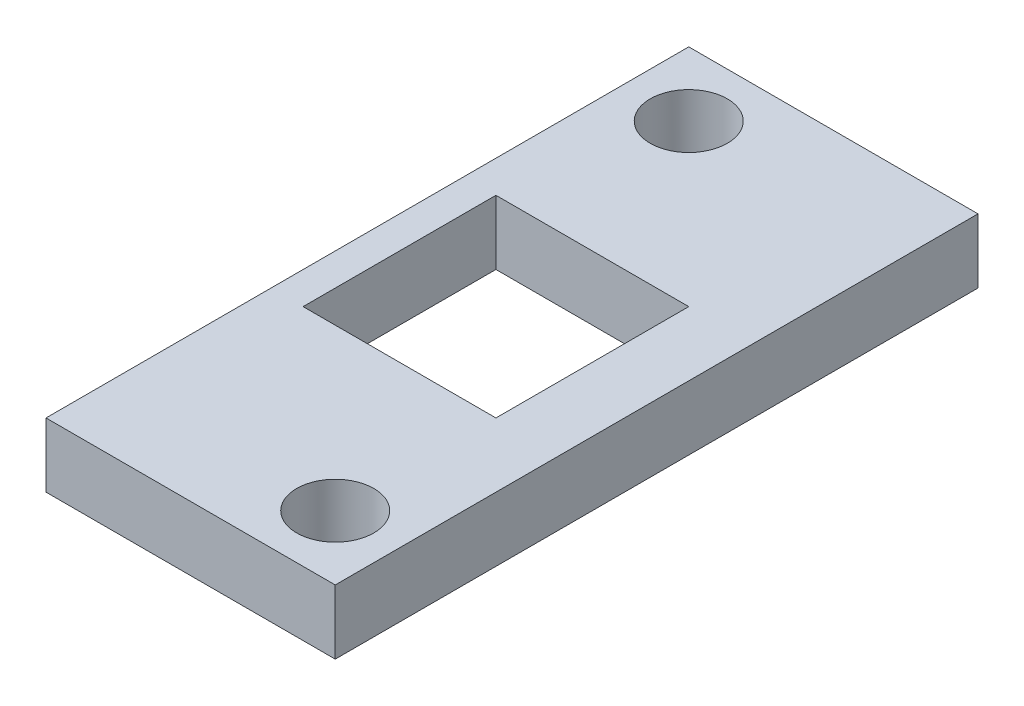
ISO-10303-21;
HEADER;
FILE_DESCRIPTION(('STEP AP214'),'2;1');
FILE_NAME('part.step','',(''),(''),'','','');
FILE_SCHEMA(('AUTOMOTIVE_DESIGN { 1 0 10303 214 1 1 1 1 }'));
ENDSEC;
DATA;
#1=APPLICATION_CONTEXT('core data for automotive mechanical design processes');
#2=APPLICATION_PROTOCOL_DEFINITION('international standard','automotive_design',2000,#1);
#3=PRODUCT_CONTEXT('',#1,'mechanical');
#4=PRODUCT('Part','Part','',(#3));
#5=PRODUCT_RELATED_PRODUCT_CATEGORY('part','',(#4));
#6=PRODUCT_DEFINITION_FORMATION('','',#4);
#7=PRODUCT_DEFINITION_CONTEXT('part definition',#1,'design');
#8=PRODUCT_DEFINITION('design','',#6,#7);
#9=PRODUCT_DEFINITION_SHAPE('','',#8);
#10=(LENGTH_UNIT() NAMED_UNIT(*) SI_UNIT(.MILLI.,.METRE.));
#11=(NAMED_UNIT(*) PLANE_ANGLE_UNIT() SI_UNIT($,.RADIAN.));
#12=(NAMED_UNIT(*) SI_UNIT($,.STERADIAN.) SOLID_ANGLE_UNIT());
#13=UNCERTAINTY_MEASURE_WITH_UNIT(LENGTH_MEASURE(1.E-05),#10,'distance_accuracy_value','');
#14=(GEOMETRIC_REPRESENTATION_CONTEXT(3) GLOBAL_UNCERTAINTY_ASSIGNED_CONTEXT((#13)) GLOBAL_UNIT_ASSIGNED_CONTEXT((#10,
#11,#12)) REPRESENTATION_CONTEXT('',''));
#15=CARTESIAN_POINT('',(0.,0.,0.));
#16=DIRECTION('',(0.,0.,1.));
#17=DIRECTION('',(1.,0.,0.));
#18=AXIS2_PLACEMENT_3D('',#15,#16,#17);
#19=CARTESIAN_POINT('',(34.,-56.,87.));
#20=DIRECTION('',(0.,1.,0.));
#21=DIRECTION('',(0.,0.,1.));
#22=AXIS2_PLACEMENT_3D('',#19,#20,#21);
#23=PLANE('',#22);
#24=CARTESIAN_POINT('',(36.,-56.,69.));
#25=DIRECTION('',(0.,1.,0.));
#26=DIRECTION('',(0.,0.,1.));
#27=AXIS2_PLACEMENT_3D('',#24,#25,#26);
#28=CIRCLE('',#27,1.2);
#29=CARTESIAN_POINT('',(36.,-56.,70.2));
#30=VERTEX_POINT('',#29);
#31=EDGE_CURVE('E119',#30,#30,#28,.F.);
#32=ORIENTED_EDGE('',*,*,#31,.F.);
#33=EDGE_LOOP('',(#32));
#34=FACE_BOUND('',#33,.T.);
#35=CARTESIAN_POINT('',(41.,-56.,85.));
#36=DIRECTION('',(0.,1.,0.));
#37=DIRECTION('',(0.,0.,1.));
#38=AXIS2_PLACEMENT_3D('',#35,#36,#37);
#39=CIRCLE('',#38,1.2);
#40=CARTESIAN_POINT('',(41.,-56.,86.2));
#41=VERTEX_POINT('',#40);
#42=EDGE_CURVE('E130',#41,#41,#39,.F.);
#43=ORIENTED_EDGE('',*,*,#42,.F.);
#44=EDGE_LOOP('',(#43));
#45=FACE_BOUND('',#44,.T.);
#46=DIRECTION('',(1.,0.,0.));
#47=VECTOR('',#46,1.);
#48=CARTESIAN_POINT('',(34.,-56.,67.));
#49=LINE('',#48,#47);
#50=CARTESIAN_POINT('',(34.,-56.,67.));
#51=VERTEX_POINT('',#50);
#52=CARTESIAN_POINT('',(43.,-56.,67.));
#53=VERTEX_POINT('',#52);
#54=EDGE_CURVE('E167',#51,#53,#49,.T.);
#55=ORIENTED_EDGE('',*,*,#54,.T.);
#56=DIRECTION('',(0.,0.,-1.));
#57=VECTOR('',#56,1.);
#58=CARTESIAN_POINT('',(43.,-56.,87.));
#59=LINE('',#58,#57);
#60=CARTESIAN_POINT('',(43.,-56.,87.));
#61=VERTEX_POINT('',#60);
#62=EDGE_CURVE('E177',#61,#53,#59,.T.);
#63=ORIENTED_EDGE('',*,*,#62,.F.);
#64=DIRECTION('',(1.,0.,0.));
#65=VECTOR('',#64,1.);
#66=CARTESIAN_POINT('',(34.,-56.,87.));
#67=LINE('',#66,#65);
#68=CARTESIAN_POINT('',(34.,-56.,87.));
#69=VERTEX_POINT('',#68);
#70=EDGE_CURVE('E157',#69,#61,#67,.T.);
#71=ORIENTED_EDGE('',*,*,#70,.F.);
#72=DIRECTION('',(0.,0.,-1.));
#73=VECTOR('',#72,1.);
#74=CARTESIAN_POINT('',(34.,-56.,87.));
#75=LINE('',#74,#73);
#76=EDGE_CURVE('E110',#69,#51,#75,.T.);
#77=ORIENTED_EDGE('',*,*,#76,.T.);
#78=EDGE_LOOP('',(#55,#63,#71,#77));
#79=FACE_BOUND('',#78,.T.);
#80=DIRECTION('',(0.,0.,-1.));
#81=VECTOR('',#80,1.);
#82=CARTESIAN_POINT('',(35.,-56.,87.));
#83=LINE('',#82,#81);
#84=CARTESIAN_POINT('',(35.,-56.,80.));
#85=VERTEX_POINT('',#84);
#86=CARTESIAN_POINT('',(35.,-56.,74.));
#87=VERTEX_POINT('',#86);
#88=EDGE_CURVE('E117',#85,#87,#83,.T.);
#89=ORIENTED_EDGE('',*,*,#88,.F.);
#90=DIRECTION('',(-1.,0.,0.));
#91=VECTOR('',#90,1.);
#92=CARTESIAN_POINT('',(34.,-56.,80.));
#93=LINE('',#92,#91);
#94=CARTESIAN_POINT('',(41.,-56.,80.));
#95=VERTEX_POINT('',#94);
#96=EDGE_CURVE('E150',#95,#85,#93,.T.);
#97=ORIENTED_EDGE('',*,*,#96,.F.);
#98=DIRECTION('',(0.,0.,1.));
#99=VECTOR('',#98,1.);
#100=CARTESIAN_POINT('',(41.,-56.,87.));
#101=LINE('',#100,#99);
#102=CARTESIAN_POINT('',(41.,-56.,74.));
#103=VERTEX_POINT('',#102);
#104=EDGE_CURVE('E148',#103,#95,#101,.T.);
#105=ORIENTED_EDGE('',*,*,#104,.F.);
#106=DIRECTION('',(1.,0.,0.));
#107=VECTOR('',#106,1.);
#108=CARTESIAN_POINT('',(34.,-56.,74.));
#109=LINE('',#108,#107);
#110=EDGE_CURVE('E146',#87,#103,#109,.T.);
#111=ORIENTED_EDGE('',*,*,#110,.F.);
#112=EDGE_LOOP('',(#89,#97,#105,#111));
#113=FACE_BOUND('',#112,.T.);
#114=ADVANCED_FACE('F41',(#34,#45,#79,#113),#23,.F.);
#115=CARTESIAN_POINT('',(34.,-54.,87.));
#116=DIRECTION('',(0.,-1.,0.));
#117=DIRECTION('',(0.,0.,-1.));
#118=AXIS2_PLACEMENT_3D('',#115,#116,#117);
#119=PLANE('',#118);
#120=CARTESIAN_POINT('',(36.,-54.,69.));
#121=DIRECTION('',(0.,-1.,0.));
#122=DIRECTION('',(0.,0.,-1.));
#123=AXIS2_PLACEMENT_3D('',#120,#121,#122);
#124=CIRCLE('',#123,1.2);
#125=CARTESIAN_POINT('',(36.,-54.,67.8));
#126=VERTEX_POINT('',#125);
#127=EDGE_CURVE('E45',#126,#126,#124,.F.);
#128=ORIENTED_EDGE('',*,*,#127,.F.);
#129=EDGE_LOOP('',(#128));
#130=FACE_BOUND('',#129,.T.);
#131=CARTESIAN_POINT('',(41.,-54.,85.));
#132=DIRECTION('',(0.,-1.,0.));
#133=DIRECTION('',(0.,0.,-1.));
#134=AXIS2_PLACEMENT_3D('',#131,#132,#133);
#135=CIRCLE('',#134,1.2);
#136=CARTESIAN_POINT('',(41.,-54.,83.8));
#137=VERTEX_POINT('',#136);
#138=EDGE_CURVE('E128',#137,#137,#135,.F.);
#139=ORIENTED_EDGE('',*,*,#138,.F.);
#140=EDGE_LOOP('',(#139));
#141=FACE_BOUND('',#140,.T.);
#142=DIRECTION('',(-1.,0.,0.));
#143=VECTOR('',#142,1.);
#144=CARTESIAN_POINT('',(34.,-54.,67.));
#145=LINE('',#144,#143);
#146=CARTESIAN_POINT('',(43.,-54.,67.));
#147=VERTEX_POINT('',#146);
#148=CARTESIAN_POINT('',(34.,-54.,67.));
#149=VERTEX_POINT('',#148);
#150=EDGE_CURVE('E158',#147,#149,#145,.T.);
#151=ORIENTED_EDGE('',*,*,#150,.T.);
#152=DIRECTION('',(0.,0.,-1.));
#153=VECTOR('',#152,1.);
#154=CARTESIAN_POINT('',(34.,-54.,87.));
#155=LINE('',#154,#153);
#156=CARTESIAN_POINT('',(34.,-54.,87.));
#157=VERTEX_POINT('',#156);
#158=EDGE_CURVE('E164',#157,#149,#155,.T.);
#159=ORIENTED_EDGE('',*,*,#158,.F.);
#160=DIRECTION('',(-1.,0.,0.));
#161=VECTOR('',#160,1.);
#162=CARTESIAN_POINT('',(34.,-54.,87.));
#163=LINE('',#162,#161);
#164=CARTESIAN_POINT('',(43.,-54.,87.));
#165=VERTEX_POINT('',#164);
#166=EDGE_CURVE('E162',#165,#157,#163,.T.);
#167=ORIENTED_EDGE('',*,*,#166,.F.);
#168=DIRECTION('',(0.,0.,-1.));
#169=VECTOR('',#168,1.);
#170=CARTESIAN_POINT('',(43.,-54.,87.));
#171=LINE('',#170,#169);
#172=EDGE_CURVE('E174',#165,#147,#171,.T.);
#173=ORIENTED_EDGE('',*,*,#172,.T.);
#174=EDGE_LOOP('',(#151,#159,#167,#173));
#175=FACE_BOUND('',#174,.T.);
#176=DIRECTION('',(0.,0.,1.));
#177=VECTOR('',#176,1.);
#178=CARTESIAN_POINT('',(35.,-54.,87.));
#179=LINE('',#178,#177);
#180=CARTESIAN_POINT('',(35.,-54.,74.));
#181=VERTEX_POINT('',#180);
#182=CARTESIAN_POINT('',(35.,-54.,80.));
#183=VERTEX_POINT('',#182);
#184=EDGE_CURVE('E11',#181,#183,#179,.T.);
#185=ORIENTED_EDGE('',*,*,#184,.F.);
#186=DIRECTION('',(-1.,0.,0.));
#187=VECTOR('',#186,1.);
#188=CARTESIAN_POINT('',(34.,-54.,74.));
#189=LINE('',#188,#187);
#190=CARTESIAN_POINT('',(41.,-54.,74.));
#191=VERTEX_POINT('',#190);
#192=EDGE_CURVE('E104',#191,#181,#189,.T.);
#193=ORIENTED_EDGE('',*,*,#192,.F.);
#194=DIRECTION('',(0.,0.,-1.));
#195=VECTOR('',#194,1.);
#196=CARTESIAN_POINT('',(41.,-54.,87.));
#197=LINE('',#196,#195);
#198=CARTESIAN_POINT('',(41.,-54.,80.));
#199=VERTEX_POINT('',#198);
#200=EDGE_CURVE('E109',#199,#191,#197,.T.);
#201=ORIENTED_EDGE('',*,*,#200,.F.);
#202=DIRECTION('',(1.,0.,0.));
#203=VECTOR('',#202,1.);
#204=CARTESIAN_POINT('',(34.,-54.,80.));
#205=LINE('',#204,#203);
#206=EDGE_CURVE('E50',#183,#199,#205,.T.);
#207=ORIENTED_EDGE('',*,*,#206,.F.);
#208=EDGE_LOOP('',(#185,#193,#201,#207));
#209=FACE_BOUND('',#208,.T.);
#210=ADVANCED_FACE('F122',(#130,#141,#175,#209),#119,.F.);
#211=CARTESIAN_POINT('',(34.,-56.,87.));
#212=DIRECTION('',(1.,0.,0.));
#213=DIRECTION('',(0.,0.,-1.));
#214=AXIS2_PLACEMENT_3D('',#211,#212,#213);
#215=PLANE('',#214);
#216=DIRECTION('',(0.,-1.,0.));
#217=VECTOR('',#216,1.);
#218=CARTESIAN_POINT('',(34.,-56.,67.));
#219=LINE('',#218,#217);
#220=EDGE_CURVE('E153',#149,#51,#219,.T.);
#221=ORIENTED_EDGE('',*,*,#220,.T.);
#222=ORIENTED_EDGE('',*,*,#76,.F.);
#223=DIRECTION('',(0.,-1.,0.));
#224=VECTOR('',#223,1.);
#225=CARTESIAN_POINT('',(34.,-56.,87.));
#226=LINE('',#225,#224);
#227=EDGE_CURVE('E154',#157,#69,#226,.T.);
#228=ORIENTED_EDGE('',*,*,#227,.F.);
#229=ORIENTED_EDGE('',*,*,#158,.T.);
#230=EDGE_LOOP('',(#221,#222,#228,#229));
#231=FACE_BOUND('',#230,.T.);
#232=ADVANCED_FACE('F43',(#231),#215,.F.);
#233=CARTESIAN_POINT('',(43.,-56.,87.));
#234=DIRECTION('',(-1.,0.,0.));
#235=DIRECTION('',(0.,0.,1.));
#236=AXIS2_PLACEMENT_3D('',#233,#234,#235);
#237=PLANE('',#236);
#238=DIRECTION('',(0.,1.,0.));
#239=VECTOR('',#238,1.);
#240=CARTESIAN_POINT('',(43.,-56.,67.));
#241=LINE('',#240,#239);
#242=EDGE_CURVE('E169',#53,#147,#241,.T.);
#243=ORIENTED_EDGE('',*,*,#242,.T.);
#244=ORIENTED_EDGE('',*,*,#172,.F.);
#245=DIRECTION('',(0.,1.,0.));
#246=VECTOR('',#245,1.);
#247=CARTESIAN_POINT('',(43.,-56.,87.));
#248=LINE('',#247,#246);
#249=EDGE_CURVE('E160',#61,#165,#248,.T.);
#250=ORIENTED_EDGE('',*,*,#249,.F.);
#251=ORIENTED_EDGE('',*,*,#62,.T.);
#252=EDGE_LOOP('',(#243,#244,#250,#251));
#253=FACE_BOUND('',#252,.T.);
#254=ADVANCED_FACE('F195',(#253),#237,.F.);
#255=CARTESIAN_POINT('',(0.,0.,87.));
#256=DIRECTION('',(0.,0.,-1.));
#257=DIRECTION('',(-1.,0.,0.));
#258=AXIS2_PLACEMENT_3D('',#255,#256,#257);
#259=PLANE('',#258);
#260=ORIENTED_EDGE('',*,*,#227,.T.);
#261=ORIENTED_EDGE('',*,*,#70,.T.);
#262=ORIENTED_EDGE('',*,*,#249,.T.);
#263=ORIENTED_EDGE('',*,*,#166,.T.);
#264=EDGE_LOOP('',(#260,#261,#262,#263));
#265=FACE_BOUND('',#264,.T.);
#266=ADVANCED_FACE('F200',(#265),#259,.F.);
#267=CARTESIAN_POINT('',(0.,0.,67.));
#268=DIRECTION('',(0.,0.,-1.));
#269=DIRECTION('',(-1.,0.,0.));
#270=AXIS2_PLACEMENT_3D('',#267,#268,#269);
#271=PLANE('',#270);
#272=ORIENTED_EDGE('',*,*,#220,.F.);
#273=ORIENTED_EDGE('',*,*,#150,.F.);
#274=ORIENTED_EDGE('',*,*,#242,.F.);
#275=ORIENTED_EDGE('',*,*,#54,.F.);
#276=EDGE_LOOP('',(#272,#273,#274,#275));
#277=FACE_BOUND('',#276,.T.);
#278=ADVANCED_FACE('F191',(#277),#271,.T.);
#279=CARTESIAN_POINT('',(35.,-53.,74.));
#280=DIRECTION('',(1.,0.,0.));
#281=DIRECTION('',(0.,0.,-1.));
#282=AXIS2_PLACEMENT_3D('',#279,#280,#281);
#283=PLANE('',#282);
#284=ORIENTED_EDGE('',*,*,#88,.T.);
#285=DIRECTION('',(0.,-1.,0.));
#286=VECTOR('',#285,1.);
#287=CARTESIAN_POINT('',(35.,-53.,74.));
#288=LINE('',#287,#286);
#289=EDGE_CURVE('E58',#181,#87,#288,.T.);
#290=ORIENTED_EDGE('',*,*,#289,.F.);
#291=ORIENTED_EDGE('',*,*,#184,.T.);
#292=DIRECTION('',(0.,-1.,0.));
#293=VECTOR('',#292,1.);
#294=CARTESIAN_POINT('',(35.,-53.,80.));
#295=LINE('',#294,#293);
#296=EDGE_CURVE('E144',#183,#85,#295,.T.);
#297=ORIENTED_EDGE('',*,*,#296,.T.);
#298=EDGE_LOOP('',(#284,#290,#291,#297));
#299=FACE_BOUND('',#298,.T.);
#300=ADVANCED_FACE('F113',(#299),#283,.T.);
#301=CARTESIAN_POINT('',(35.,-53.,80.));
#302=DIRECTION('',(0.,0.,-1.));
#303=DIRECTION('',(-1.,0.,0.));
#304=AXIS2_PLACEMENT_3D('',#301,#302,#303);
#305=PLANE('',#304);
#306=ORIENTED_EDGE('',*,*,#96,.T.);
#307=ORIENTED_EDGE('',*,*,#296,.F.);
#308=ORIENTED_EDGE('',*,*,#206,.T.);
#309=DIRECTION('',(0.,-1.,0.));
#310=VECTOR('',#309,1.);
#311=CARTESIAN_POINT('',(41.,-53.,80.));
#312=LINE('',#311,#310);
#313=EDGE_CURVE('E142',#199,#95,#312,.T.);
#314=ORIENTED_EDGE('',*,*,#313,.T.);
#315=EDGE_LOOP('',(#306,#307,#308,#314));
#316=FACE_BOUND('',#315,.T.);
#317=ADVANCED_FACE('F235',(#316),#305,.T.);
#318=CARTESIAN_POINT('',(41.,-53.,74.));
#319=DIRECTION('',(-1.,0.,0.));
#320=DIRECTION('',(0.,0.,1.));
#321=AXIS2_PLACEMENT_3D('',#318,#319,#320);
#322=PLANE('',#321);
#323=ORIENTED_EDGE('',*,*,#104,.T.);
#324=ORIENTED_EDGE('',*,*,#313,.F.);
#325=ORIENTED_EDGE('',*,*,#200,.T.);
#326=DIRECTION('',(0.,-1.,0.));
#327=VECTOR('',#326,1.);
#328=CARTESIAN_POINT('',(41.,-53.,74.));
#329=LINE('',#328,#327);
#330=EDGE_CURVE('E63',#191,#103,#329,.T.);
#331=ORIENTED_EDGE('',*,*,#330,.T.);
#332=EDGE_LOOP('',(#323,#324,#325,#331));
#333=FACE_BOUND('',#332,.T.);
#334=ADVANCED_FACE('F232',(#333),#322,.T.);
#335=CARTESIAN_POINT('',(35.,-53.,74.));
#336=DIRECTION('',(0.,0.,1.));
#337=DIRECTION('',(1.,0.,0.));
#338=AXIS2_PLACEMENT_3D('',#335,#336,#337);
#339=PLANE('',#338);
#340=ORIENTED_EDGE('',*,*,#110,.T.);
#341=ORIENTED_EDGE('',*,*,#330,.F.);
#342=ORIENTED_EDGE('',*,*,#192,.T.);
#343=ORIENTED_EDGE('',*,*,#289,.T.);
#344=EDGE_LOOP('',(#340,#341,#342,#343));
#345=FACE_BOUND('',#344,.T.);
#346=ADVANCED_FACE('F105',(#345),#339,.T.);
#347=CARTESIAN_POINT('',(41.,-53.,85.));
#348=DIRECTION('',(0.,-1.,0.));
#349=DIRECTION('',(0.,0.,-1.));
#350=AXIS2_PLACEMENT_3D('',#347,#348,#349);
#351=CYLINDRICAL_SURFACE('',#350,1.2);
#352=ORIENTED_EDGE('',*,*,#138,.T.);
#353=EDGE_LOOP('',(#352));
#354=FACE_BOUND('',#353,.T.);
#355=ORIENTED_EDGE('',*,*,#42,.T.);
#356=EDGE_LOOP('',(#355));
#357=FACE_BOUND('',#356,.T.);
#358=ADVANCED_FACE('F223',(#354,#357),#351,.F.);
#359=CARTESIAN_POINT('',(36.,-53.,69.));
#360=DIRECTION('',(0.,-1.,0.));
#361=DIRECTION('',(0.,0.,-1.));
#362=AXIS2_PLACEMENT_3D('',#359,#360,#361);
#363=CYLINDRICAL_SURFACE('',#362,1.2);
#364=ORIENTED_EDGE('',*,*,#127,.T.);
#365=EDGE_LOOP('',(#364));
#366=FACE_BOUND('',#365,.T.);
#367=ORIENTED_EDGE('',*,*,#31,.T.);
#368=EDGE_LOOP('',(#367));
#369=FACE_BOUND('',#368,.T.);
#370=ADVANCED_FACE('F221',(#366,#369),#363,.F.);
#371=CLOSED_SHELL('',(#114,#210,#232,#254,#266,#278,#300,#317,#334,#346,#358,#370));
#372=MANIFOLD_SOLID_BREP('B2',#371);
#373=ADVANCED_BREP_SHAPE_REPRESENTATION('',(#18,#372),#14);
#374=SHAPE_DEFINITION_REPRESENTATION(#9,#373);
ENDSEC;
END-ISO-10303-21;
